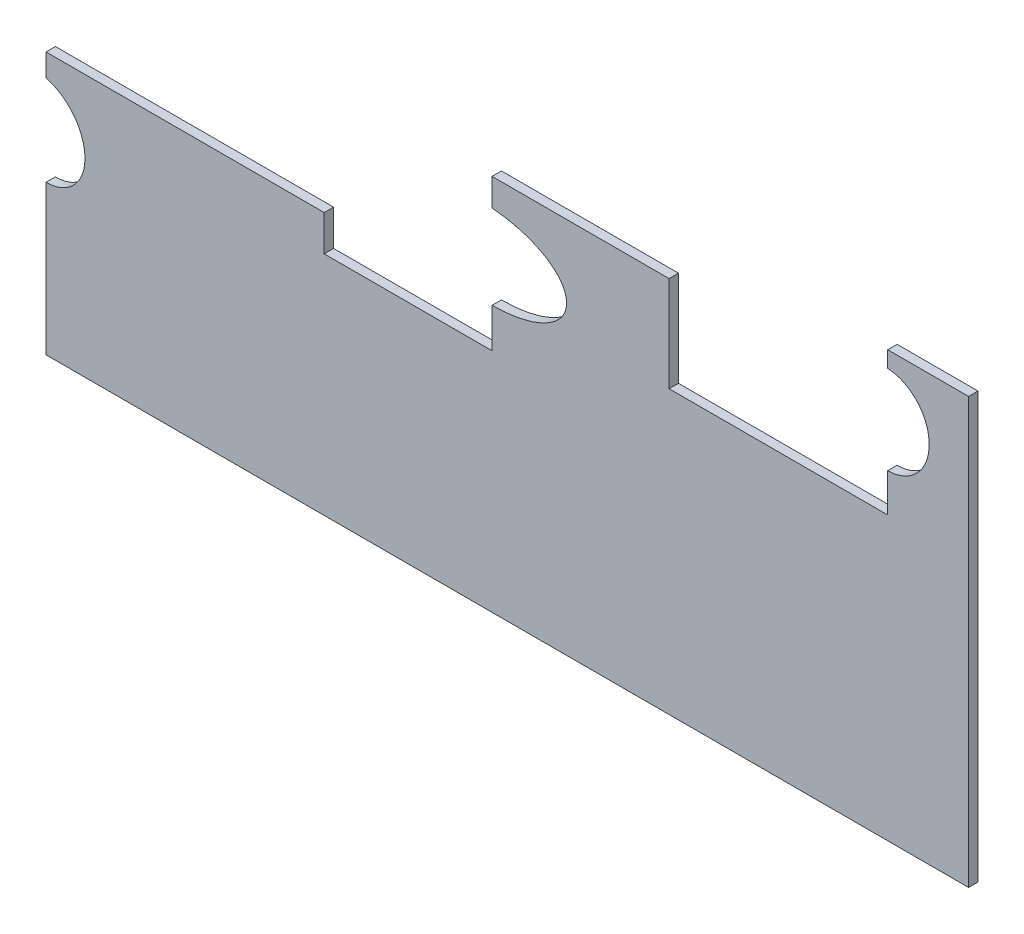
ISO-10303-21;
HEADER;
FILE_DESCRIPTION(('STEP AP214'),'2;1');
FILE_NAME('part.step','',(''),(''),'','','');
FILE_SCHEMA(('AUTOMOTIVE_DESIGN { 1 0 10303 214 1 1 1 1 }'));
ENDSEC;
DATA;
#1=APPLICATION_CONTEXT('core data for automotive mechanical design processes');
#2=APPLICATION_PROTOCOL_DEFINITION('international standard','automotive_design',2000,#1);
#3=PRODUCT_CONTEXT('',#1,'mechanical');
#4=PRODUCT('Part','Part','',(#3));
#5=PRODUCT_RELATED_PRODUCT_CATEGORY('part','',(#4));
#6=PRODUCT_DEFINITION_FORMATION('','',#4);
#7=PRODUCT_DEFINITION_CONTEXT('part definition',#1,'design');
#8=PRODUCT_DEFINITION('design','',#6,#7);
#9=PRODUCT_DEFINITION_SHAPE('','',#8);
#10=(LENGTH_UNIT() NAMED_UNIT(*) SI_UNIT(.MILLI.,.METRE.));
#11=(NAMED_UNIT(*) PLANE_ANGLE_UNIT() SI_UNIT($,.RADIAN.));
#12=(NAMED_UNIT(*) SI_UNIT($,.STERADIAN.) SOLID_ANGLE_UNIT());
#13=UNCERTAINTY_MEASURE_WITH_UNIT(LENGTH_MEASURE(1.E-05),#10,'distance_accuracy_value','');
#14=(GEOMETRIC_REPRESENTATION_CONTEXT(3) GLOBAL_UNCERTAINTY_ASSIGNED_CONTEXT((#13)) GLOBAL_UNIT_ASSIGNED_CONTEXT((#10,
#11,#12)) REPRESENTATION_CONTEXT('',''));
#15=CARTESIAN_POINT('',(0.,0.,0.));
#16=DIRECTION('',(0.,0.,1.));
#17=DIRECTION('',(1.,0.,0.));
#18=AXIS2_PLACEMENT_3D('',#15,#16,#17);
#19=CARTESIAN_POINT('',(0.,0.,3.));
#20=DIRECTION('',(0.,0.,1.));
#21=DIRECTION('',(1.,0.,0.));
#22=AXIS2_PLACEMENT_3D('',#19,#20,#21);
#23=PLANE('',#22);
#24=DIRECTION('',(0.,-1.,0.));
#25=VECTOR('',#24,1.);
#26=CARTESIAN_POINT('',(-294.810863717899,337.82,3.));
#27=LINE('',#26,#25);
#28=CARTESIAN_POINT('',(-294.810863699264,301.747656566378,3.));
#29=VERTEX_POINT('',#28);
#30=CARTESIAN_POINT('',(-294.810863717899,254.,3.));
#31=VERTEX_POINT('',#30);
#32=EDGE_CURVE('E404',#29,#31,#27,.T.);
#33=ORIENTED_EDGE('',*,*,#32,.T.);
#34=DIRECTION('',(1.,0.,0.));
#35=VECTOR('',#34,1.);
#36=CARTESIAN_POINT('',(-330.2,254.,3.));
#37=LINE('',#36,#35);
#38=CARTESIAN_POINT('',(3.88578058618805E-13,254.,3.));
#39=VERTEX_POINT('',#38);
#40=EDGE_CURVE('E189',#31,#39,#37,.T.);
#41=ORIENTED_EDGE('',*,*,#40,.T.);
#42=DIRECTION('',(0.,1.,0.));
#43=VECTOR('',#42,1.);
#44=CARTESIAN_POINT('',(3.88578058618805E-13,254.,3.));
#45=LINE('',#44,#43);
#46=CARTESIAN_POINT('',(0.,389.89,3.));
#47=VERTEX_POINT('',#46);
#48=EDGE_CURVE('E181',#39,#47,#45,.T.);
#49=ORIENTED_EDGE('',*,*,#48,.T.);
#50=DIRECTION('',(-1.,0.,0.));
#51=VECTOR('',#50,1.);
#52=CARTESIAN_POINT('',(0.,389.89,3.));
#53=LINE('',#52,#51);
#54=CARTESIAN_POINT('',(-25.8511043857541,389.89,3.));
#55=VERTEX_POINT('',#54);
#56=EDGE_CURVE('E162',#47,#55,#53,.T.);
#57=ORIENTED_EDGE('',*,*,#56,.T.);
#58=DIRECTION('',(0.,-1.,0.));
#59=VECTOR('',#58,1.);
#60=CARTESIAN_POINT('',(-25.8511043857541,389.89,3.));
#61=LINE('',#60,#59);
#62=CARTESIAN_POINT('',(-25.8511043857541,384.684807622964,3.));
#63=VERTEX_POINT('',#62);
#64=EDGE_CURVE('E223',#55,#63,#61,.T.);
#65=ORIENTED_EDGE('',*,*,#64,.T.);
#66=CARTESIAN_POINT('',(-29.0946134597729,384.409392838052,3.));
#67=CARTESIAN_POINT('',(-29.3753195281884,384.349132794048,3.));
#68=CARTESIAN_POINT('',(-29.9328457444512,384.21051113471,3.));
#69=CARTESIAN_POINT('',(-31.1156394738647,383.827797032111,3.));
#70=CARTESIAN_POINT('',(-33.2873808662302,382.853955404532,3.));
#71=CARTESIAN_POINT('',(-36.5808931997181,380.334793707062,3.));
#72=CARTESIAN_POINT('',(-39.1133437974078,375.76745399545,3.));
#73=CARTESIAN_POINT('',(-39.7781245953779,371.238575823073,3.));
#74=CARTESIAN_POINT('',(-39.453462961189,367.698185467533,3.));
#75=CARTESIAN_POINT('',(-38.2964308114098,364.336482677175,3.));
#76=CARTESIAN_POINT('',(-35.8314279612169,360.47948488639,3.));
#77=CARTESIAN_POINT('',(-31.6475273235242,357.35396516562,3.));
#78=CARTESIAN_POINT('',(-27.6102581657051,356.408525111382,3.));
#79=CARTESIAN_POINT('',(-25.2301705180342,356.41183876869,3.));
#80=CARTESIAN_POINT('',(-23.9945131509963,356.548301078333,3.));
#81=CARTESIAN_POINT('',(-23.1465660648976,356.701928853351,3.));
#82=CARTESIAN_POINT('',(-22.3102767405033,356.909861342358,3.));
#83=CARTESIAN_POINT('',(-21.1274830110898,357.292575444957,3.));
#84=CARTESIAN_POINT('',(-18.9557416187243,358.266417072537,3.));
#85=CARTESIAN_POINT('',(-15.6622292852364,360.785578770007,3.));
#86=CARTESIAN_POINT('',(-13.1297786875467,365.352918481618,3.));
#87=CARTESIAN_POINT('',(-12.4649978895767,369.881796653995,3.));
#88=CARTESIAN_POINT('',(-12.7896595237655,373.422187009536,3.));
#89=CARTESIAN_POINT('',(-13.9466916735447,376.783889799894,3.));
#90=CARTESIAN_POINT('',(-16.4116945237376,380.640887590679,3.));
#91=CARTESIAN_POINT('',(-20.5955951614303,383.766407311448,3.));
#92=CARTESIAN_POINT('',(-24.6328643192494,384.711847365687,3.));
#93=CARTESIAN_POINT('',(-27.0129519669203,384.708533708378,3.));
#94=CARTESIAN_POINT('',(-28.2486093339582,384.572071398735,3.));
#95=CARTESIAN_POINT('',(-28.8139073913574,384.469652882057,3.));
#96=CARTESIAN_POINT('',(-29.0946134597729,384.409392838052,3.));
#97=B_SPLINE_CURVE_WITH_KNOTS('',3,(#66,#67,#68,#69,#70,#71,#72,#73,#74,#75,#76,#77,#78,#79,#80,
#81,#82,#83,#84,#85,#86,#87,#88,#89,#90,#91,#92,#93,#94,#95,#96),.UNSPECIFIED.,.T.,.F.,(4,1,1,1,
1,1,1,1,1,1,1,1,1,1,1,1,1,1,1,1,1,1,1,1,1,1,1,1,4),(0.,0.015625,0.03125,0.0625,0.125,0.1875,
0.21875,0.25,0.28125,0.3125,0.375,0.4375,0.46875,0.484375,0.5,0.515625,0.53125,0.5625,0.625,
0.6875,0.71875,0.75,0.78125,0.8125,0.875,0.9375,0.96875,0.984375,1.),.UNSPECIFIED.);
#98=CARTESIAN_POINT('',(-25.8511043857541,356.424229156133,3.));
#99=VERTEX_POINT('',#98);
#100=EDGE_CURVE('E206',#99,#63,#97,.T.);
#101=ORIENTED_EDGE('',*,*,#100,.F.);
#102=CARTESIAN_POINT('',(-25.8511043857541,344.17,3.));
#103=VERTEX_POINT('',#102);
#104=EDGE_CURVE('E174',#99,#103,#61,.T.);
#105=ORIENTED_EDGE('',*,*,#104,.T.);
#106=DIRECTION('',(-1.,0.,0.));
#107=VECTOR('',#106,1.);
#108=CARTESIAN_POINT('',(-25.8511043857541,344.17,3.));
#109=LINE('',#108,#107);
#110=CARTESIAN_POINT('',(-95.7011043857541,344.17,3.));
#111=VERTEX_POINT('',#110);
#112=EDGE_CURVE('E231',#103,#111,#109,.T.);
#113=ORIENTED_EDGE('',*,*,#112,.T.);
#114=DIRECTION('',(0.,1.,0.));
#115=VECTOR('',#114,1.);
#116=CARTESIAN_POINT('',(-95.7011043857541,374.65,3.));
#117=LINE('',#116,#115);
#118=CARTESIAN_POINT('',(-95.7011043857541,374.65,3.));
#119=VERTEX_POINT('',#118);
#120=EDGE_CURVE('E438',#111,#119,#117,.T.);
#121=ORIENTED_EDGE('',*,*,#120,.T.);
#122=DIRECTION('',(-1.,0.,0.));
#123=VECTOR('',#122,1.);
#124=CARTESIAN_POINT('',(-152.287972712288,374.65,3.));
#125=LINE('',#124,#123);
#126=CARTESIAN_POINT('',(-152.287972712288,374.65,3.));
#127=VERTEX_POINT('',#126);
#128=EDGE_CURVE('E435',#119,#127,#125,.T.);
#129=ORIENTED_EDGE('',*,*,#128,.T.);
#130=DIRECTION('',(0.,-1.,0.));
#131=VECTOR('',#130,1.);
#132=CARTESIAN_POINT('',(-152.287972712288,374.65,3.));
#133=LINE('',#132,#131);
#134=CARTESIAN_POINT('',(-152.287972712288,365.899713224505,3.));
#135=VERTEX_POINT('',#134);
#136=EDGE_CURVE('E427',#127,#135,#133,.T.);
#137=ORIENTED_EDGE('',*,*,#136,.T.);
#138=CARTESIAN_POINT('',(-180.06890529091,353.920439433414,3.));
#139=CARTESIAN_POINT('',(-180.08542296501,353.618309147155,3.));
#140=CARTESIAN_POINT('',(-180.081950788175,353.012052682706,3.));
#141=CARTESIAN_POINT('',(-179.905256870865,351.701966023305,3.));
#142=CARTESIAN_POINT('',(-179.071932530781,349.235984488898,3.));
#143=CARTESIAN_POINT('',(-176.547678645732,346.101494922666,3.));
#144=CARTESIAN_POINT('',(-171.788832256863,343.101891305137,3.));
#145=CARTESIAN_POINT('',(-167.066920590984,341.126264083659,3.));
#146=CARTESIAN_POINT('',(-161.345782683623,339.656260683919,3.));
#147=CARTESIAN_POINT('',(-155.018201928842,338.900335340752,3.));
#148=CARTESIAN_POINT('',(-148.645925656541,338.961950616262,3.));
#149=CARTESIAN_POINT('',(-142.798632236169,339.7994997828,3.));
#150=CARTESIAN_POINT('',(-137.88948884558,341.248590487087,3.));
#151=CARTESIAN_POINT('',(-132.832001496986,343.711528272326,3.));
#152=CARTESIAN_POINT('',(-129.981083908872,346.552153454004,3.));
#153=CARTESIAN_POINT('',(-128.883895778252,348.912592521178,3.));
#154=CARTESIAN_POINT('',(-128.565435112998,350.195608733172,3.));
#155=CARTESIAN_POINT('',(-128.461120803144,351.09900575405,3.));
#156=CARTESIAN_POINT('',(-128.466329068397,352.008390450724,3.));
#157=CARTESIAN_POINT('',(-128.643022985707,353.318477110125,3.));
#158=CARTESIAN_POINT('',(-129.476347325791,355.784458644532,3.));
#159=CARTESIAN_POINT('',(-132.000601210839,358.918948210765,3.));
#160=CARTESIAN_POINT('',(-136.759447599708,361.918551828293,3.));
#161=CARTESIAN_POINT('',(-141.481359265588,363.894179049771,3.));
#162=CARTESIAN_POINT('',(-147.202497172949,365.364182449511,3.));
#163=CARTESIAN_POINT('',(-153.53007792773,366.120107792679,3.));
#164=CARTESIAN_POINT('',(-159.902354200031,366.058492517168,3.));
#165=CARTESIAN_POINT('',(-165.749647620403,365.22094335063,3.));
#166=CARTESIAN_POINT('',(-170.658791010992,363.771852646343,3.));
#167=CARTESIAN_POINT('',(-175.716278359585,361.308914861104,3.));
#168=CARTESIAN_POINT('',(-178.5671959477,358.468289679426,3.));
#169=CARTESIAN_POINT('',(-179.66438407832,356.107850612252,3.));
#170=CARTESIAN_POINT('',(-179.982844743574,354.824834400258,3.));
#171=CARTESIAN_POINT('',(-180.05238761681,354.222569719672,3.));
#172=CARTESIAN_POINT('',(-180.06890529091,353.920439433414,3.));
#173=B_SPLINE_CURVE_WITH_KNOTS('',3,(#138,#139,#140,#141,#142,#143,#144,#145,#146,#147,#148,
#149,#150,#151,#152,#153,#154,#155,#156,#157,#158,#159,#160,#161,#162,#163,#164,#165,#166,#167,
#168,#169,#170,#171,#172),.UNSPECIFIED.,.T.,.F.,(4,1,1,1,1,1,1,1,1,1,1,1,1,1,1,1,1,1,1,1,1,1,1,
1,1,1,1,1,1,1,1,1,4),(0.,0.015625,0.03125,0.0625,0.125,0.15625,0.1875,0.21875,0.25,0.28125,
0.3125,0.34375,0.375,0.4375,0.46875,0.484375,0.5,0.515625,0.53125,0.5625,0.625,0.65625,0.6875,
0.71875,0.75,0.78125,0.8125,0.84375,0.875,0.9375,0.96875,0.984375,1.),.UNSPECIFIED.);
#174=CARTESIAN_POINT('',(-152.287972712288,338.96234555557,3.));
#175=VERTEX_POINT('',#174);
#176=EDGE_CURVE('E237',#175,#135,#173,.T.);
#177=ORIENTED_EDGE('',*,*,#176,.F.);
#178=CARTESIAN_POINT('',(-152.287972712288,326.39,3.));
#179=VERTEX_POINT('',#178);
#180=EDGE_CURVE('E431',#175,#179,#133,.T.);
#181=ORIENTED_EDGE('',*,*,#180,.T.);
#182=DIRECTION('',(-1.,0.,0.));
#183=VECTOR('',#182,1.);
#184=CARTESIAN_POINT('',(-152.287972712288,326.39,3.));
#185=LINE('',#184,#183);
#186=CARTESIAN_POINT('',(-205.910863717899,326.39,3.));
#187=VERTEX_POINT('',#186);
#188=EDGE_CURVE('E423',#179,#187,#185,.T.);
#189=ORIENTED_EDGE('',*,*,#188,.T.);
#190=DIRECTION('',(0.,1.,0.));
#191=VECTOR('',#190,1.);
#192=CARTESIAN_POINT('',(-205.910863717899,326.39,3.));
#193=LINE('',#192,#191);
#194=CARTESIAN_POINT('',(-205.910863717899,337.82,3.));
#195=VERTEX_POINT('',#194);
#196=EDGE_CURVE('E420',#187,#195,#193,.T.);
#197=ORIENTED_EDGE('',*,*,#196,.T.);
#198=DIRECTION('',(-1.,0.,0.));
#199=VECTOR('',#198,1.);
#200=CARTESIAN_POINT('',(-205.910863717899,337.82,3.));
#201=LINE('',#200,#199);
#202=CARTESIAN_POINT('',(-294.810863717899,337.82,3.));
#203=VERTEX_POINT('',#202);
#204=EDGE_CURVE('E417',#195,#203,#201,.T.);
#205=ORIENTED_EDGE('',*,*,#204,.T.);
#206=CARTESIAN_POINT('',(-294.810863717899,330.61420908245,3.));
#207=VERTEX_POINT('',#206);
#208=EDGE_CURVE('E185',#203,#207,#27,.T.);
#209=ORIENTED_EDGE('',*,*,#208,.T.);
#210=CARTESIAN_POINT('',(-305.942171992685,328.501522761815,3.));
#211=CARTESIAN_POINT('',(-306.170255378111,328.324665908958,3.));
#212=CARTESIAN_POINT('',(-306.614042298807,327.954986533331,3.));
#213=CARTESIAN_POINT('',(-307.512202671429,327.084665698121,3.));
#214=CARTESIAN_POINT('',(-309.028565353801,325.224006494095,3.));
#215=CARTESIAN_POINT('',(-310.814681604544,321.397067184566,3.));
#216=CARTESIAN_POINT('',(-310.908770444278,315.937871103878,3.));
#217=CARTESIAN_POINT('',(-309.331820466115,311.311401642085,3.));
#218=CARTESIAN_POINT('',(-307.336526947015,308.049254205305,3.));
#219=CARTESIAN_POINT('',(-304.674018187799,305.304468378733,3.));
#220=CARTESIAN_POINT('',(-300.585989718074,302.625100142516,3.));
#221=CARTESIAN_POINT('',(-295.275340886978,301.35676124855,3.));
#222=CARTESIAN_POINT('',(-291.124175678951,302.133615903969,3.));
#223=CARTESIAN_POINT('',(-288.944522892512,303.138863231042,3.));
#224=CARTESIAN_POINT('',(-287.87795689343,303.791999802329,3.));
#225=CARTESIAN_POINT('',(-287.175136961922,304.298621856033,3.));
#226=CARTESIAN_POINT('',(-286.509456580878,304.853140919472,3.));
#227=CARTESIAN_POINT('',(-285.611296208256,305.723461754682,3.));
#228=CARTESIAN_POINT('',(-284.094933525883,307.584120958708,3.));
#229=CARTESIAN_POINT('',(-282.308817275141,311.411060268237,3.));
#230=CARTESIAN_POINT('',(-282.214728435407,316.870256348926,3.));
#231=CARTESIAN_POINT('',(-283.79167841357,321.496725810719,3.));
#232=CARTESIAN_POINT('',(-285.786971932669,324.758873247499,3.));
#233=CARTESIAN_POINT('',(-288.449480691885,327.503659074071,3.));
#234=CARTESIAN_POINT('',(-292.53750916161,330.183027310288,3.));
#235=CARTESIAN_POINT('',(-297.848157992706,331.451366204253,3.));
#236=CARTESIAN_POINT('',(-301.999323200734,330.674511548835,3.));
#237=CARTESIAN_POINT('',(-304.178975987173,329.669264221762,3.));
#238=CARTESIAN_POINT('',(-305.245541986254,329.016127650475,3.));
#239=CARTESIAN_POINT('',(-305.71408860726,328.678379614672,3.));
#240=CARTESIAN_POINT('',(-305.942171992685,328.501522761815,3.));
#241=B_SPLINE_CURVE_WITH_KNOTS('',3,(#210,#211,#212,#213,#214,#215,#216,#217,#218,#219,#220,
#221,#222,#223,#224,#225,#226,#227,#228,#229,#230,#231,#232,#233,#234,#235,#236,#237,#238,#239,
#240),.UNSPECIFIED.,.T.,.F.,(4,1,1,1,1,1,1,1,1,1,1,1,1,1,1,1,1,1,1,1,1,1,1,1,1,1,1,1,4),(0.,
0.015625,0.03125,0.0625,0.125,0.1875,0.21875,0.25,0.28125,0.3125,0.375,0.4375,0.46875,0.484375,
0.5,0.515625,0.53125,0.5625,0.625,0.6875,0.71875,0.75,0.78125,0.8125,0.875,0.9375,0.96875,
0.984375,1.),.UNSPECIFIED.);
#242=EDGE_CURVE('E341',#29,#207,#241,.T.);
#243=ORIENTED_EDGE('',*,*,#242,.F.);
#244=EDGE_LOOP('',(#33,#41,#49,#57,#65,#101,#105,#113,#121,#129,#137,#177,#181,#189,#197,#205,
#209,#243));
#245=FACE_BOUND('',#244,.T.);
#246=ADVANCED_FACE('F38',(#245),#23,.T.);
#247=CARTESIAN_POINT('',(0.,0.,0.));
#248=DIRECTION('',(0.,0.,1.));
#249=DIRECTION('',(1.,0.,0.));
#250=AXIS2_PLACEMENT_3D('',#247,#248,#249);
#251=PLANE('',#250);
#252=DIRECTION('',(1.,0.,0.));
#253=VECTOR('',#252,1.);
#254=CARTESIAN_POINT('',(-330.2,254.,0.));
#255=LINE('',#254,#253);
#256=CARTESIAN_POINT('',(-294.810863717899,254.,0.));
#257=VERTEX_POINT('',#256);
#258=CARTESIAN_POINT('',(3.88578058618805E-13,254.,0.));
#259=VERTEX_POINT('',#258);
#260=EDGE_CURVE('E192',#257,#259,#255,.T.);
#261=ORIENTED_EDGE('',*,*,#260,.F.);
#262=DIRECTION('',(0.,-1.,0.));
#263=VECTOR('',#262,1.);
#264=CARTESIAN_POINT('',(-294.810863717899,337.82,0.));
#265=LINE('',#264,#263);
#266=CARTESIAN_POINT('',(-294.810863717899,301.747656566378,0.));
#267=VERTEX_POINT('',#266);
#268=EDGE_CURVE('E307',#267,#257,#265,.T.);
#269=ORIENTED_EDGE('',*,*,#268,.F.);
#270=CARTESIAN_POINT('',(-305.942171992685,328.501522761815,0.));
#271=CARTESIAN_POINT('',(-306.170255378111,328.324665908958,0.));
#272=CARTESIAN_POINT('',(-306.614042298807,327.954986533331,0.));
#273=CARTESIAN_POINT('',(-307.512202671429,327.084665698121,0.));
#274=CARTESIAN_POINT('',(-309.028565353801,325.224006494095,0.));
#275=CARTESIAN_POINT('',(-310.814681604544,321.397067184566,0.));
#276=CARTESIAN_POINT('',(-310.908770444278,315.937871103878,0.));
#277=CARTESIAN_POINT('',(-309.331820466115,311.311401642085,0.));
#278=CARTESIAN_POINT('',(-307.336526947015,308.049254205305,0.));
#279=CARTESIAN_POINT('',(-304.674018187799,305.304468378733,0.));
#280=CARTESIAN_POINT('',(-300.585989718074,302.625100142516,0.));
#281=CARTESIAN_POINT('',(-295.275340886978,301.35676124855,0.));
#282=CARTESIAN_POINT('',(-291.124175678951,302.133615903969,0.));
#283=CARTESIAN_POINT('',(-288.944522892512,303.138863231042,0.));
#284=CARTESIAN_POINT('',(-287.87795689343,303.791999802329,0.));
#285=CARTESIAN_POINT('',(-287.175136961922,304.298621856033,0.));
#286=CARTESIAN_POINT('',(-286.509456580878,304.853140919472,0.));
#287=CARTESIAN_POINT('',(-285.611296208256,305.723461754682,0.));
#288=CARTESIAN_POINT('',(-284.094933525883,307.584120958708,0.));
#289=CARTESIAN_POINT('',(-282.308817275141,311.411060268237,0.));
#290=CARTESIAN_POINT('',(-282.214728435407,316.870256348926,0.));
#291=CARTESIAN_POINT('',(-283.79167841357,321.496725810719,0.));
#292=CARTESIAN_POINT('',(-285.786971932669,324.758873247499,0.));
#293=CARTESIAN_POINT('',(-288.449480691885,327.503659074071,0.));
#294=CARTESIAN_POINT('',(-292.53750916161,330.183027310288,0.));
#295=CARTESIAN_POINT('',(-297.848157992706,331.451366204253,0.));
#296=CARTESIAN_POINT('',(-301.999323200734,330.674511548835,0.));
#297=CARTESIAN_POINT('',(-304.178975987173,329.669264221762,0.));
#298=CARTESIAN_POINT('',(-305.245541986254,329.016127650475,0.));
#299=CARTESIAN_POINT('',(-305.71408860726,328.678379614672,0.));
#300=CARTESIAN_POINT('',(-305.942171992685,328.501522761815,0.));
#301=B_SPLINE_CURVE_WITH_KNOTS('',3,(#270,#271,#272,#273,#274,#275,#276,#277,#278,#279,#280,
#281,#282,#283,#284,#285,#286,#287,#288,#289,#290,#291,#292,#293,#294,#295,#296,#297,#298,#299,
#300),.UNSPECIFIED.,.T.,.F.,(4,1,1,1,1,1,1,1,1,1,1,1,1,1,1,1,1,1,1,1,1,1,1,1,1,1,1,1,4),(0.,
0.015625,0.03125,0.0625,0.125,0.1875,0.21875,0.25,0.28125,0.3125,0.375,0.4375,0.46875,0.484375,
0.5,0.515625,0.53125,0.5625,0.625,0.6875,0.71875,0.75,0.78125,0.8125,0.875,0.9375,0.96875,
0.984375,1.),.UNSPECIFIED.);
#302=CARTESIAN_POINT('',(-294.810863701132,330.61420908245,0.));
#303=VERTEX_POINT('',#302);
#304=EDGE_CURVE('E312',#267,#303,#301,.T.);
#305=ORIENTED_EDGE('',*,*,#304,.T.);
#306=CARTESIAN_POINT('',(-294.810863717899,337.82,0.));
#307=VERTEX_POINT('',#306);
#308=EDGE_CURVE('E175',#307,#303,#265,.T.);
#309=ORIENTED_EDGE('',*,*,#308,.F.);
#310=DIRECTION('',(-1.,0.,0.));
#311=VECTOR('',#310,1.);
#312=CARTESIAN_POINT('',(-205.910863717899,337.82,0.));
#313=LINE('',#312,#311);
#314=CARTESIAN_POINT('',(-205.910863717899,337.82,0.));
#315=VERTEX_POINT('',#314);
#316=EDGE_CURVE('E303',#315,#307,#313,.T.);
#317=ORIENTED_EDGE('',*,*,#316,.F.);
#318=DIRECTION('',(0.,1.,0.));
#319=VECTOR('',#318,1.);
#320=CARTESIAN_POINT('',(-205.910863717899,326.39,0.));
#321=LINE('',#320,#319);
#322=CARTESIAN_POINT('',(-205.910863717899,326.39,0.));
#323=VERTEX_POINT('',#322);
#324=EDGE_CURVE('E299',#323,#315,#321,.T.);
#325=ORIENTED_EDGE('',*,*,#324,.F.);
#326=DIRECTION('',(-1.,0.,0.));
#327=VECTOR('',#326,1.);
#328=CARTESIAN_POINT('',(-152.287972712288,326.39,0.));
#329=LINE('',#328,#327);
#330=CARTESIAN_POINT('',(-152.287972712288,326.39,0.));
#331=VERTEX_POINT('',#330);
#332=EDGE_CURVE('E295',#331,#323,#329,.T.);
#333=ORIENTED_EDGE('',*,*,#332,.F.);
#334=DIRECTION('',(0.,-1.,0.));
#335=VECTOR('',#334,1.);
#336=CARTESIAN_POINT('',(-152.287972712288,374.65,0.));
#337=LINE('',#336,#335);
#338=CARTESIAN_POINT('',(-152.287972712288,338.96234555557,0.));
#339=VERTEX_POINT('',#338);
#340=EDGE_CURVE('E292',#339,#331,#337,.T.);
#341=ORIENTED_EDGE('',*,*,#340,.F.);
#342=CARTESIAN_POINT('',(-180.06890529091,353.920439433414,0.));
#343=CARTESIAN_POINT('',(-180.08542296501,353.618309147155,0.));
#344=CARTESIAN_POINT('',(-180.081950788175,353.012052682706,0.));
#345=CARTESIAN_POINT('',(-179.905256870865,351.701966023305,0.));
#346=CARTESIAN_POINT('',(-179.071932530781,349.235984488898,0.));
#347=CARTESIAN_POINT('',(-176.547678645732,346.101494922666,0.));
#348=CARTESIAN_POINT('',(-171.788832256863,343.101891305137,0.));
#349=CARTESIAN_POINT('',(-167.066920590984,341.126264083659,0.));
#350=CARTESIAN_POINT('',(-161.345782683623,339.656260683919,0.));
#351=CARTESIAN_POINT('',(-155.018201928842,338.900335340752,0.));
#352=CARTESIAN_POINT('',(-148.645925656541,338.961950616262,0.));
#353=CARTESIAN_POINT('',(-142.798632236169,339.7994997828,0.));
#354=CARTESIAN_POINT('',(-137.88948884558,341.248590487087,0.));
#355=CARTESIAN_POINT('',(-132.832001496986,343.711528272326,0.));
#356=CARTESIAN_POINT('',(-129.981083908872,346.552153454004,0.));
#357=CARTESIAN_POINT('',(-128.883895778252,348.912592521178,0.));
#358=CARTESIAN_POINT('',(-128.565435112998,350.195608733172,0.));
#359=CARTESIAN_POINT('',(-128.461120803144,351.09900575405,0.));
#360=CARTESIAN_POINT('',(-128.466329068397,352.008390450724,0.));
#361=CARTESIAN_POINT('',(-128.643022985707,353.318477110125,0.));
#362=CARTESIAN_POINT('',(-129.476347325791,355.784458644532,0.));
#363=CARTESIAN_POINT('',(-132.000601210839,358.918948210765,0.));
#364=CARTESIAN_POINT('',(-136.759447599708,361.918551828293,0.));
#365=CARTESIAN_POINT('',(-141.481359265588,363.894179049771,0.));
#366=CARTESIAN_POINT('',(-147.202497172949,365.364182449511,0.));
#367=CARTESIAN_POINT('',(-153.53007792773,366.120107792679,0.));
#368=CARTESIAN_POINT('',(-159.902354200031,366.058492517168,0.));
#369=CARTESIAN_POINT('',(-165.749647620403,365.22094335063,0.));
#370=CARTESIAN_POINT('',(-170.658791010992,363.771852646343,0.));
#371=CARTESIAN_POINT('',(-175.716278359585,361.308914861104,0.));
#372=CARTESIAN_POINT('',(-178.5671959477,358.468289679426,0.));
#373=CARTESIAN_POINT('',(-179.66438407832,356.107850612252,0.));
#374=CARTESIAN_POINT('',(-179.982844743574,354.824834400258,0.));
#375=CARTESIAN_POINT('',(-180.05238761681,354.222569719672,0.));
#376=CARTESIAN_POINT('',(-180.06890529091,353.920439433414,0.));
#377=B_SPLINE_CURVE_WITH_KNOTS('',3,(#342,#343,#344,#345,#346,#347,#348,#349,#350,#351,#352,
#353,#354,#355,#356,#357,#358,#359,#360,#361,#362,#363,#364,#365,#366,#367,#368,#369,#370,#371,
#372,#373,#374,#375,#376),.UNSPECIFIED.,.T.,.F.,(4,1,1,1,1,1,1,1,1,1,1,1,1,1,1,1,1,1,1,1,1,1,1,
1,1,1,1,1,1,1,1,1,4),(0.,0.015625,0.03125,0.0625,0.125,0.15625,0.1875,0.21875,0.25,0.28125,
0.3125,0.34375,0.375,0.4375,0.46875,0.484375,0.5,0.515625,0.53125,0.5625,0.625,0.65625,0.6875,
0.71875,0.75,0.78125,0.8125,0.84375,0.875,0.9375,0.96875,0.984375,1.),.UNSPECIFIED.);
#378=CARTESIAN_POINT('',(-152.287972712161,365.899713224505,0.));
#379=VERTEX_POINT('',#378);
#380=EDGE_CURVE('E242',#339,#379,#377,.T.);
#381=ORIENTED_EDGE('',*,*,#380,.T.);
#382=CARTESIAN_POINT('',(-152.287972712288,374.65,0.));
#383=VERTEX_POINT('',#382);
#384=EDGE_CURVE('E62',#383,#379,#337,.T.);
#385=ORIENTED_EDGE('',*,*,#384,.F.);
#386=DIRECTION('',(-1.,0.,0.));
#387=VECTOR('',#386,1.);
#388=CARTESIAN_POINT('',(-152.287972712288,374.65,0.));
#389=LINE('',#388,#387);
#390=CARTESIAN_POINT('',(-95.7011043857541,374.65,0.));
#391=VERTEX_POINT('',#390);
#392=EDGE_CURVE('E288',#391,#383,#389,.T.);
#393=ORIENTED_EDGE('',*,*,#392,.F.);
#394=DIRECTION('',(0.,1.,0.));
#395=VECTOR('',#394,1.);
#396=CARTESIAN_POINT('',(-95.7011043857541,374.65,0.));
#397=LINE('',#396,#395);
#398=CARTESIAN_POINT('',(-95.7011043857541,344.17,0.));
#399=VERTEX_POINT('',#398);
#400=EDGE_CURVE('E284',#399,#391,#397,.T.);
#401=ORIENTED_EDGE('',*,*,#400,.F.);
#402=DIRECTION('',(-1.,0.,0.));
#403=VECTOR('',#402,1.);
#404=CARTESIAN_POINT('',(-25.8511043857541,344.17,0.));
#405=LINE('',#404,#403);
#406=CARTESIAN_POINT('',(-25.8511043857541,344.17,0.));
#407=VERTEX_POINT('',#406);
#408=EDGE_CURVE('E280',#407,#399,#405,.T.);
#409=ORIENTED_EDGE('',*,*,#408,.F.);
#410=DIRECTION('',(0.,-1.,0.));
#411=VECTOR('',#410,1.);
#412=CARTESIAN_POINT('',(-25.8511043857541,389.89,0.));
#413=LINE('',#412,#411);
#414=CARTESIAN_POINT('',(-25.8511043857541,356.424229156133,0.));
#415=VERTEX_POINT('',#414);
#416=EDGE_CURVE('E272',#415,#407,#413,.T.);
#417=ORIENTED_EDGE('',*,*,#416,.F.);
#418=CARTESIAN_POINT('',(-29.0946134597729,384.409392838052,0.));
#419=CARTESIAN_POINT('',(-29.3753195281884,384.349132794048,0.));
#420=CARTESIAN_POINT('',(-29.9328457444512,384.21051113471,0.));
#421=CARTESIAN_POINT('',(-31.1156394738647,383.827797032111,0.));
#422=CARTESIAN_POINT('',(-33.2873808662302,382.853955404532,0.));
#423=CARTESIAN_POINT('',(-36.5808931997181,380.334793707062,0.));
#424=CARTESIAN_POINT('',(-39.1133437974078,375.76745399545,0.));
#425=CARTESIAN_POINT('',(-39.7781245953779,371.238575823073,0.));
#426=CARTESIAN_POINT('',(-39.453462961189,367.698185467533,0.));
#427=CARTESIAN_POINT('',(-38.2964308114098,364.336482677175,0.));
#428=CARTESIAN_POINT('',(-35.8314279612169,360.47948488639,0.));
#429=CARTESIAN_POINT('',(-31.6475273235242,357.35396516562,0.));
#430=CARTESIAN_POINT('',(-27.6102581657051,356.408525111382,0.));
#431=CARTESIAN_POINT('',(-25.2301705180342,356.41183876869,0.));
#432=CARTESIAN_POINT('',(-23.9945131509963,356.548301078333,0.));
#433=CARTESIAN_POINT('',(-23.1465660648976,356.701928853351,0.));
#434=CARTESIAN_POINT('',(-22.3102767405033,356.909861342358,0.));
#435=CARTESIAN_POINT('',(-21.1274830110898,357.292575444957,0.));
#436=CARTESIAN_POINT('',(-18.9557416187243,358.266417072537,0.));
#437=CARTESIAN_POINT('',(-15.6622292852364,360.785578770007,0.));
#438=CARTESIAN_POINT('',(-13.1297786875467,365.352918481618,0.));
#439=CARTESIAN_POINT('',(-12.4649978895767,369.881796653995,0.));
#440=CARTESIAN_POINT('',(-12.7896595237655,373.422187009536,0.));
#441=CARTESIAN_POINT('',(-13.9466916735447,376.783889799894,0.));
#442=CARTESIAN_POINT('',(-16.4116945237376,380.640887590679,0.));
#443=CARTESIAN_POINT('',(-20.5955951614303,383.766407311448,0.));
#444=CARTESIAN_POINT('',(-24.6328643192494,384.711847365687,0.));
#445=CARTESIAN_POINT('',(-27.0129519669203,384.708533708378,0.));
#446=CARTESIAN_POINT('',(-28.2486093339582,384.572071398735,0.));
#447=CARTESIAN_POINT('',(-28.8139073913574,384.469652882057,0.));
#448=CARTESIAN_POINT('',(-29.0946134597729,384.409392838052,0.));
#449=B_SPLINE_CURVE_WITH_KNOTS('',3,(#418,#419,#420,#421,#422,#423,#424,#425,#426,#427,#428,
#429,#430,#431,#432,#433,#434,#435,#436,#437,#438,#439,#440,#441,#442,#443,#444,#445,#446,#447,
#448),.UNSPECIFIED.,.T.,.F.,(4,1,1,1,1,1,1,1,1,1,1,1,1,1,1,1,1,1,1,1,1,1,1,1,1,1,1,1,4),(0.,
0.015625,0.03125,0.0625,0.125,0.1875,0.21875,0.25,0.28125,0.3125,0.375,0.4375,0.46875,0.484375,
0.5,0.515625,0.53125,0.5625,0.625,0.6875,0.71875,0.75,0.78125,0.8125,0.875,0.9375,0.96875,
0.984375,1.),.UNSPECIFIED.);
#450=CARTESIAN_POINT('',(-25.85110438575,384.684807622964,0.));
#451=VERTEX_POINT('',#450);
#452=EDGE_CURVE('E200',#415,#451,#449,.T.);
#453=ORIENTED_EDGE('',*,*,#452,.T.);
#454=CARTESIAN_POINT('',(-25.8511043857541,389.89,0.));
#455=VERTEX_POINT('',#454);
#456=EDGE_CURVE('E54',#455,#451,#413,.T.);
#457=ORIENTED_EDGE('',*,*,#456,.F.);
#458=DIRECTION('',(-1.,0.,0.));
#459=VECTOR('',#458,1.);
#460=CARTESIAN_POINT('',(0.,389.89,0.));
#461=LINE('',#460,#459);
#462=CARTESIAN_POINT('',(0.,389.89,0.));
#463=VERTEX_POINT('',#462);
#464=EDGE_CURVE('E270',#463,#455,#461,.T.);
#465=ORIENTED_EDGE('',*,*,#464,.F.);
#466=DIRECTION('',(0.,1.,0.));
#467=VECTOR('',#466,1.);
#468=CARTESIAN_POINT('',(3.88578058618805E-13,254.,0.));
#469=LINE('',#468,#467);
#470=EDGE_CURVE('E183',#259,#463,#469,.T.);
#471=ORIENTED_EDGE('',*,*,#470,.F.);
#472=EDGE_LOOP('',(#261,#269,#305,#309,#317,#325,#333,#341,#381,#385,#393,#401,#409,#417,#453,
#457,#465,#471));
#473=FACE_BOUND('',#472,.T.);
#474=ADVANCED_FACE('F258',(#473),#251,.F.);
#475=CARTESIAN_POINT('',(3.88578058618805E-13,254.,3.));
#476=DIRECTION('',(-1.,0.,0.));
#477=DIRECTION('',(0.,-1.,0.));
#478=AXIS2_PLACEMENT_3D('',#475,#476,#477);
#479=PLANE('',#478);
#480=ORIENTED_EDGE('',*,*,#470,.T.);
#481=DIRECTION('',(0.,0.,-1.));
#482=VECTOR('',#481,1.);
#483=CARTESIAN_POINT('',(0.,389.89,3.));
#484=LINE('',#483,#482);
#485=EDGE_CURVE('E166',#47,#463,#484,.T.);
#486=ORIENTED_EDGE('',*,*,#485,.F.);
#487=ORIENTED_EDGE('',*,*,#48,.F.);
#488=DIRECTION('',(0.,0.,-1.));
#489=VECTOR('',#488,1.);
#490=CARTESIAN_POINT('',(3.88578058618805E-13,254.,3.));
#491=LINE('',#490,#489);
#492=EDGE_CURVE('E196',#39,#259,#491,.T.);
#493=ORIENTED_EDGE('',*,*,#492,.T.);
#494=EDGE_LOOP('',(#480,#486,#487,#493));
#495=FACE_BOUND('',#494,.T.);
#496=ADVANCED_FACE('F40',(#495),#479,.F.);
#497=CARTESIAN_POINT('',(-330.2,254.,3.));
#498=DIRECTION('',(0.,1.,0.));
#499=DIRECTION('',(0.,0.,1.));
#500=AXIS2_PLACEMENT_3D('',#497,#498,#499);
#501=PLANE('',#500);
#502=ORIENTED_EDGE('',*,*,#40,.F.);
#503=DIRECTION('',(0.,0.,-1.));
#504=VECTOR('',#503,1.);
#505=CARTESIAN_POINT('',(-294.810863717899,254.,3.));
#506=LINE('',#505,#504);
#507=EDGE_CURVE('E267',#31,#257,#506,.T.);
#508=ORIENTED_EDGE('',*,*,#507,.T.);
#509=ORIENTED_EDGE('',*,*,#260,.T.);
#510=ORIENTED_EDGE('',*,*,#492,.F.);
#511=EDGE_LOOP('',(#502,#508,#509,#510));
#512=FACE_BOUND('',#511,.T.);
#513=ADVANCED_FACE('F254',(#512),#501,.F.);
#514=DIRECTION('',(0.,0.,-1.));
#515=VECTOR('',#514,1.);
#516=SURFACE_OF_LINEAR_EXTRUSION('',#97,#515);
#517=DIRECTION('',(0.,0.,-1.));
#518=VECTOR('',#517,1.);
#519=CARTESIAN_POINT('',(-25.8511043857541,356.424229156133,3.));
#520=LINE('',#519,#518);
#521=EDGE_CURVE('E11',#99,#415,#520,.T.);
#522=ORIENTED_EDGE('',*,*,#521,.F.);
#523=ORIENTED_EDGE('',*,*,#100,.T.);
#524=DIRECTION('',(0.,0.,-1.));
#525=VECTOR('',#524,1.);
#526=CARTESIAN_POINT('',(-25.8511043857541,384.684807622964,3.));
#527=LINE('',#526,#525);
#528=EDGE_CURVE('E47',#451,#63,#527,.F.);
#529=ORIENTED_EDGE('',*,*,#528,.F.);
#530=ORIENTED_EDGE('',*,*,#452,.F.);
#531=EDGE_LOOP('',(#522,#523,#529,#530));
#532=FACE_BOUND('',#531,.T.);
#533=ADVANCED_FACE('F234',(#532),#516,.T.);
#534=DIRECTION('',(0.,0.,-1.));
#535=VECTOR('',#534,1.);
#536=SURFACE_OF_LINEAR_EXTRUSION('',#173,#535);
#537=DIRECTION('',(0.,0.,-1.));
#538=VECTOR('',#537,1.);
#539=CARTESIAN_POINT('',(-152.287972712288,338.96234555557,3.));
#540=LINE('',#539,#538);
#541=EDGE_CURVE('E219',#175,#339,#540,.T.);
#542=ORIENTED_EDGE('',*,*,#541,.F.);
#543=ORIENTED_EDGE('',*,*,#176,.T.);
#544=DIRECTION('',(0.,0.,-1.));
#545=VECTOR('',#544,1.);
#546=CARTESIAN_POINT('',(-152.287972712288,365.899713224515,3.));
#547=LINE('',#546,#545);
#548=EDGE_CURVE('E216',#379,#135,#547,.F.);
#549=ORIENTED_EDGE('',*,*,#548,.F.);
#550=ORIENTED_EDGE('',*,*,#380,.F.);
#551=EDGE_LOOP('',(#542,#543,#549,#550));
#552=FACE_BOUND('',#551,.T.);
#553=ADVANCED_FACE('F253',(#552),#536,.T.);
#554=DIRECTION('',(0.,0.,-1.));
#555=VECTOR('',#554,1.);
#556=SURFACE_OF_LINEAR_EXTRUSION('',#241,#555);
#557=DIRECTION('',(0.,0.,-1.));
#558=VECTOR('',#557,1.);
#559=CARTESIAN_POINT('',(-294.810863717899,301.747656566378,3.));
#560=LINE('',#559,#558);
#561=EDGE_CURVE('E213',#29,#267,#560,.T.);
#562=ORIENTED_EDGE('',*,*,#561,.F.);
#563=ORIENTED_EDGE('',*,*,#242,.T.);
#564=DIRECTION('',(0.,0.,-1.));
#565=VECTOR('',#564,1.);
#566=CARTESIAN_POINT('',(-294.810863717899,330.614209086683,3.));
#567=LINE('',#566,#565);
#568=EDGE_CURVE('E210',#303,#207,#567,.F.);
#569=ORIENTED_EDGE('',*,*,#568,.F.);
#570=ORIENTED_EDGE('',*,*,#304,.F.);
#571=EDGE_LOOP('',(#562,#563,#569,#570));
#572=FACE_BOUND('',#571,.T.);
#573=ADVANCED_FACE('F353',(#572),#556,.T.);
#574=CARTESIAN_POINT('',(-294.810863717899,337.82,3.));
#575=DIRECTION('',(1.,0.,0.));
#576=DIRECTION('',(0.,1.,0.));
#577=AXIS2_PLACEMENT_3D('',#574,#575,#576);
#578=PLANE('',#577);
#579=ORIENTED_EDGE('',*,*,#568,.T.);
#580=ORIENTED_EDGE('',*,*,#208,.F.);
#581=DIRECTION('',(0.,0.,-1.));
#582=VECTOR('',#581,1.);
#583=CARTESIAN_POINT('',(-294.810863717899,337.82,3.));
#584=LINE('',#583,#582);
#585=EDGE_CURVE('E313',#203,#307,#584,.T.);
#586=ORIENTED_EDGE('',*,*,#585,.T.);
#587=ORIENTED_EDGE('',*,*,#308,.T.);
#588=EDGE_LOOP('',(#579,#580,#586,#587));
#589=FACE_BOUND('',#588,.T.);
#590=ADVANCED_FACE('F356',(#589),#578,.F.);
#591=CARTESIAN_POINT('',(-152.287972712288,374.65,3.));
#592=DIRECTION('',(1.,0.,0.));
#593=DIRECTION('',(0.,0.,-1.));
#594=AXIS2_PLACEMENT_3D('',#591,#592,#593);
#595=PLANE('',#594);
#596=ORIENTED_EDGE('',*,*,#541,.T.);
#597=ORIENTED_EDGE('',*,*,#340,.T.);
#598=DIRECTION('',(0.,0.,-1.));
#599=VECTOR('',#598,1.);
#600=CARTESIAN_POINT('',(-152.287972712288,326.39,3.));
#601=LINE('',#600,#599);
#602=EDGE_CURVE('E322',#179,#331,#601,.T.);
#603=ORIENTED_EDGE('',*,*,#602,.F.);
#604=ORIENTED_EDGE('',*,*,#180,.F.);
#605=EDGE_LOOP('',(#596,#597,#603,#604));
#606=FACE_BOUND('',#605,.T.);
#607=ADVANCED_FACE('F379',(#606),#595,.F.);
#608=CARTESIAN_POINT('',(-152.287972712288,326.39,3.));
#609=DIRECTION('',(0.,-1.,0.));
#610=DIRECTION('',(0.,0.,-1.));
#611=AXIS2_PLACEMENT_3D('',#608,#609,#610);
#612=PLANE('',#611);
#613=ORIENTED_EDGE('',*,*,#332,.T.);
#614=DIRECTION('',(0.,0.,-1.));
#615=VECTOR('',#614,1.);
#616=CARTESIAN_POINT('',(-205.910863717899,326.39,3.));
#617=LINE('',#616,#615);
#618=EDGE_CURVE('E319',#187,#323,#617,.T.);
#619=ORIENTED_EDGE('',*,*,#618,.F.);
#620=ORIENTED_EDGE('',*,*,#188,.F.);
#621=ORIENTED_EDGE('',*,*,#602,.T.);
#622=EDGE_LOOP('',(#613,#619,#620,#621));
#623=FACE_BOUND('',#622,.T.);
#624=ADVANCED_FACE('F380',(#623),#612,.F.);
#625=CARTESIAN_POINT('',(-205.910863717899,326.39,3.));
#626=DIRECTION('',(-1.,0.,0.));
#627=DIRECTION('',(0.,0.,1.));
#628=AXIS2_PLACEMENT_3D('',#625,#626,#627);
#629=PLANE('',#628);
#630=ORIENTED_EDGE('',*,*,#324,.T.);
#631=DIRECTION('',(0.,0.,-1.));
#632=VECTOR('',#631,1.);
#633=CARTESIAN_POINT('',(-205.910863717899,337.82,3.));
#634=LINE('',#633,#632);
#635=EDGE_CURVE('E316',#195,#315,#634,.T.);
#636=ORIENTED_EDGE('',*,*,#635,.F.);
#637=ORIENTED_EDGE('',*,*,#196,.F.);
#638=ORIENTED_EDGE('',*,*,#618,.T.);
#639=EDGE_LOOP('',(#630,#636,#637,#638));
#640=FACE_BOUND('',#639,.T.);
#641=ADVANCED_FACE('F383',(#640),#629,.F.);
#642=CARTESIAN_POINT('',(-205.910863717899,337.82,3.));
#643=DIRECTION('',(0.,-1.,0.));
#644=DIRECTION('',(0.,0.,-1.));
#645=AXIS2_PLACEMENT_3D('',#642,#643,#644);
#646=PLANE('',#645);
#647=ORIENTED_EDGE('',*,*,#316,.T.);
#648=ORIENTED_EDGE('',*,*,#585,.F.);
#649=ORIENTED_EDGE('',*,*,#204,.F.);
#650=ORIENTED_EDGE('',*,*,#635,.T.);
#651=EDGE_LOOP('',(#647,#648,#649,#650));
#652=FACE_BOUND('',#651,.T.);
#653=ADVANCED_FACE('F387',(#652),#646,.F.);
#654=ORIENTED_EDGE('',*,*,#561,.T.);
#655=ORIENTED_EDGE('',*,*,#268,.T.);
#656=ORIENTED_EDGE('',*,*,#507,.F.);
#657=ORIENTED_EDGE('',*,*,#32,.F.);
#658=EDGE_LOOP('',(#654,#655,#656,#657));
#659=FACE_BOUND('',#658,.T.);
#660=ADVANCED_FACE('F378',(#659),#578,.F.);
#661=ORIENTED_EDGE('',*,*,#548,.T.);
#662=ORIENTED_EDGE('',*,*,#136,.F.);
#663=DIRECTION('',(0.,0.,-1.));
#664=VECTOR('',#663,1.);
#665=CARTESIAN_POINT('',(-152.287972712288,374.65,3.));
#666=LINE('',#665,#664);
#667=EDGE_CURVE('E326',#127,#383,#666,.T.);
#668=ORIENTED_EDGE('',*,*,#667,.T.);
#669=ORIENTED_EDGE('',*,*,#384,.T.);
#670=EDGE_LOOP('',(#661,#662,#668,#669));
#671=FACE_BOUND('',#670,.T.);
#672=ADVANCED_FACE('F375',(#671),#595,.F.);
#673=CARTESIAN_POINT('',(-25.8511043857541,389.89,3.));
#674=DIRECTION('',(1.,0.,0.));
#675=DIRECTION('',(0.,1.,0.));
#676=AXIS2_PLACEMENT_3D('',#673,#674,#675);
#677=PLANE('',#676);
#678=ORIENTED_EDGE('',*,*,#521,.T.);
#679=ORIENTED_EDGE('',*,*,#416,.T.);
#680=DIRECTION('',(0.,0.,-1.));
#681=VECTOR('',#680,1.);
#682=CARTESIAN_POINT('',(-25.8511043857541,344.17,3.));
#683=LINE('',#682,#681);
#684=EDGE_CURVE('E335',#103,#407,#683,.T.);
#685=ORIENTED_EDGE('',*,*,#684,.F.);
#686=ORIENTED_EDGE('',*,*,#104,.F.);
#687=EDGE_LOOP('',(#678,#679,#685,#686));
#688=FACE_BOUND('',#687,.T.);
#689=ADVANCED_FACE('F363',(#688),#677,.F.);
#690=CARTESIAN_POINT('',(-25.8511043857541,344.17,3.));
#691=DIRECTION('',(0.,-1.,0.));
#692=DIRECTION('',(0.,0.,-1.));
#693=AXIS2_PLACEMENT_3D('',#690,#691,#692);
#694=PLANE('',#693);
#695=ORIENTED_EDGE('',*,*,#408,.T.);
#696=DIRECTION('',(0.,0.,-1.));
#697=VECTOR('',#696,1.);
#698=CARTESIAN_POINT('',(-95.7011043857541,344.17,3.));
#699=LINE('',#698,#697);
#700=EDGE_CURVE('E332',#111,#399,#699,.T.);
#701=ORIENTED_EDGE('',*,*,#700,.F.);
#702=ORIENTED_EDGE('',*,*,#112,.F.);
#703=ORIENTED_EDGE('',*,*,#684,.T.);
#704=EDGE_LOOP('',(#695,#701,#702,#703));
#705=FACE_BOUND('',#704,.T.);
#706=ADVANCED_FACE('F364',(#705),#694,.F.);
#707=CARTESIAN_POINT('',(-95.7011043857541,374.65,3.));
#708=DIRECTION('',(-1.,0.,0.));
#709=DIRECTION('',(0.,0.,1.));
#710=AXIS2_PLACEMENT_3D('',#707,#708,#709);
#711=PLANE('',#710);
#712=ORIENTED_EDGE('',*,*,#400,.T.);
#713=DIRECTION('',(0.,0.,-1.));
#714=VECTOR('',#713,1.);
#715=CARTESIAN_POINT('',(-95.7011043857541,374.65,3.));
#716=LINE('',#715,#714);
#717=EDGE_CURVE('E329',#119,#391,#716,.T.);
#718=ORIENTED_EDGE('',*,*,#717,.F.);
#719=ORIENTED_EDGE('',*,*,#120,.F.);
#720=ORIENTED_EDGE('',*,*,#700,.T.);
#721=EDGE_LOOP('',(#712,#718,#719,#720));
#722=FACE_BOUND('',#721,.T.);
#723=ADVANCED_FACE('F367',(#722),#711,.F.);
#724=CARTESIAN_POINT('',(-152.287972712288,374.65,3.));
#725=DIRECTION('',(0.,-1.,0.));
#726=DIRECTION('',(0.,0.,-1.));
#727=AXIS2_PLACEMENT_3D('',#724,#725,#726);
#728=PLANE('',#727);
#729=ORIENTED_EDGE('',*,*,#392,.T.);
#730=ORIENTED_EDGE('',*,*,#667,.F.);
#731=ORIENTED_EDGE('',*,*,#128,.F.);
#732=ORIENTED_EDGE('',*,*,#717,.T.);
#733=EDGE_LOOP('',(#729,#730,#731,#732));
#734=FACE_BOUND('',#733,.T.);
#735=ADVANCED_FACE('F362',(#734),#728,.F.);
#736=ORIENTED_EDGE('',*,*,#528,.T.);
#737=ORIENTED_EDGE('',*,*,#64,.F.);
#738=DIRECTION('',(0.,0.,-1.));
#739=VECTOR('',#738,1.);
#740=CARTESIAN_POINT('',(-25.8511043857541,389.89,3.));
#741=LINE('',#740,#739);
#742=EDGE_CURVE('E168',#55,#455,#741,.T.);
#743=ORIENTED_EDGE('',*,*,#742,.T.);
#744=ORIENTED_EDGE('',*,*,#456,.T.);
#745=EDGE_LOOP('',(#736,#737,#743,#744));
#746=FACE_BOUND('',#745,.T.);
#747=ADVANCED_FACE('F222',(#746),#677,.F.);
#748=CARTESIAN_POINT('',(0.,389.89,3.));
#749=DIRECTION('',(0.,-1.,0.));
#750=DIRECTION('',(0.,0.,-1.));
#751=AXIS2_PLACEMENT_3D('',#748,#749,#750);
#752=PLANE('',#751);
#753=ORIENTED_EDGE('',*,*,#464,.T.);
#754=ORIENTED_EDGE('',*,*,#742,.F.);
#755=ORIENTED_EDGE('',*,*,#56,.F.);
#756=ORIENTED_EDGE('',*,*,#485,.T.);
#757=EDGE_LOOP('',(#753,#754,#755,#756));
#758=FACE_BOUND('',#757,.T.);
#759=ADVANCED_FACE('F165',(#758),#752,.F.);
#760=CLOSED_SHELL('',(#246,#474,#496,#513,#533,#553,#573,#590,#607,#624,#641,#653,#660,#672,
#689,#706,#723,#735,#747,#759));
#761=MANIFOLD_SOLID_BREP('B2',#760);
#762=ADVANCED_BREP_SHAPE_REPRESENTATION('',(#18,#761),#14);
#763=SHAPE_DEFINITION_REPRESENTATION(#9,#762);
ENDSEC;
END-ISO-10303-21;
